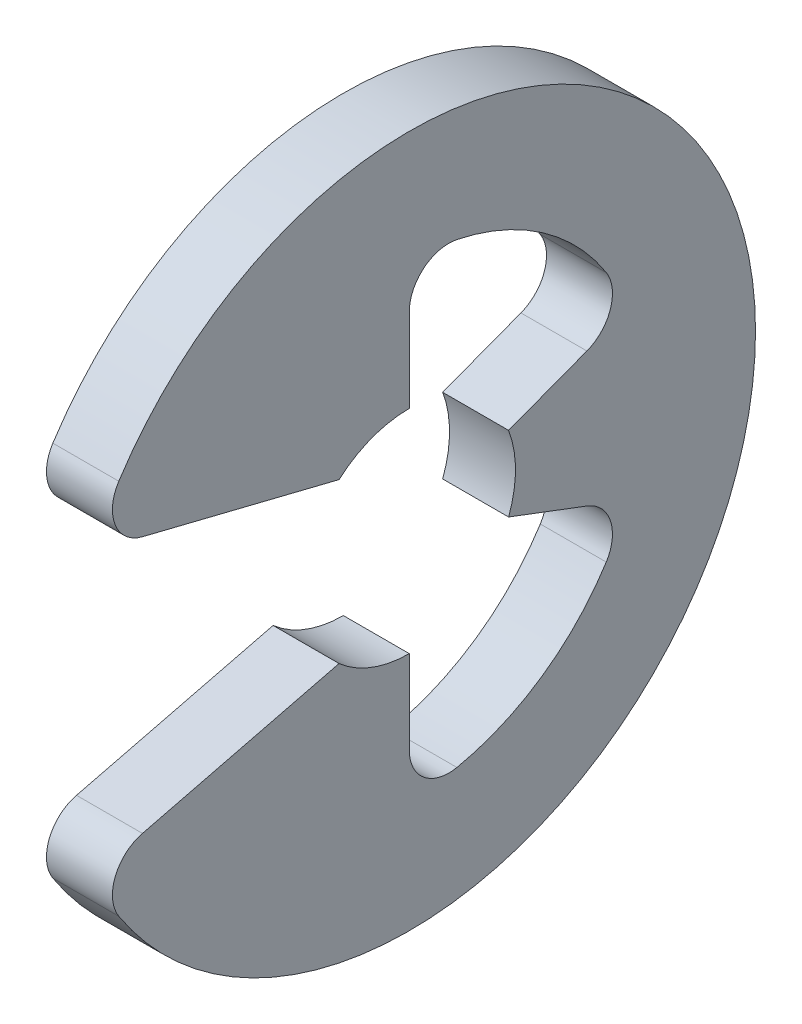
ISO-10303-21;
HEADER;
FILE_DESCRIPTION(('STEP AP214'),'2;1');
FILE_NAME('part.step','',(''),(''),'','','');
FILE_SCHEMA(('AUTOMOTIVE_DESIGN { 1 0 10303 214 1 1 1 1 }'));
ENDSEC;
DATA;
#1=APPLICATION_CONTEXT('core data for automotive mechanical design processes');
#2=APPLICATION_PROTOCOL_DEFINITION('international standard','automotive_design',2000,#1);
#3=PRODUCT_CONTEXT('',#1,'mechanical');
#4=PRODUCT('Part','Part','',(#3));
#5=PRODUCT_RELATED_PRODUCT_CATEGORY('part','',(#4));
#6=PRODUCT_DEFINITION_FORMATION('','',#4);
#7=PRODUCT_DEFINITION_CONTEXT('part definition',#1,'design');
#8=PRODUCT_DEFINITION('design','',#6,#7);
#9=PRODUCT_DEFINITION_SHAPE('','',#8);
#10=(LENGTH_UNIT() NAMED_UNIT(*) SI_UNIT(.MILLI.,.METRE.));
#11=(NAMED_UNIT(*) PLANE_ANGLE_UNIT() SI_UNIT($,.RADIAN.));
#12=(NAMED_UNIT(*) SI_UNIT($,.STERADIAN.) SOLID_ANGLE_UNIT());
#13=UNCERTAINTY_MEASURE_WITH_UNIT(LENGTH_MEASURE(1.E-05),#10,'distance_accuracy_value','');
#14=(GEOMETRIC_REPRESENTATION_CONTEXT(3) GLOBAL_UNCERTAINTY_ASSIGNED_CONTEXT((#13)) GLOBAL_UNIT_ASSIGNED_CONTEXT((#10,
#11,#12)) REPRESENTATION_CONTEXT('',''));
#15=CARTESIAN_POINT('',(0.,0.,0.));
#16=DIRECTION('',(0.,0.,1.));
#17=DIRECTION('',(1.,0.,0.));
#18=AXIS2_PLACEMENT_3D('',#15,#16,#17);
#19=CARTESIAN_POINT('',(0.25,1.26497562316669,1.950759255468));
#20=DIRECTION('',(-1.,0.,0.));
#21=DIRECTION('',(0.,0.,1.));
#22=AXIS2_PLACEMENT_3D('',#19,#20,#21);
#23=CYLINDRICAL_SURFACE('',#22,0.3);
#24=CARTESIAN_POINT('',(-0.25,1.26497562316669,1.950759255468));
#25=DIRECTION('',(-1.,0.,0.));
#26=DIRECTION('',(0.,0.,1.));
#27=AXIS2_PLACEMENT_3D('',#24,#25,#26);
#28=CIRCLE('',#27,0.3);
#29=CARTESIAN_POINT('',(-0.25,0.973814574189076,2.02304510165006));
#30=VERTEX_POINT('',#29);
#31=CARTESIAN_POINT('',(-0.25,1.42819828422045,2.20247012714128));
#32=VERTEX_POINT('',#31);
#33=EDGE_CURVE('E200',#30,#32,#28,.T.);
#34=ORIENTED_EDGE('',*,*,#33,.F.);
#35=DIRECTION('',(-1.,0.,0.));
#36=VECTOR('',#35,1.);
#37=CARTESIAN_POINT('',(0.25,0.973814574189076,2.02304510165006));
#38=LINE('',#37,#36);
#39=CARTESIAN_POINT('',(0.25,0.973814574189076,2.02304510165006));
#40=VERTEX_POINT('',#39);
#41=EDGE_CURVE('E11',#40,#30,#38,.T.);
#42=ORIENTED_EDGE('',*,*,#41,.F.);
#43=CARTESIAN_POINT('',(0.25,1.26497562316669,1.950759255468));
#44=DIRECTION('',(-1.,0.,0.));
#45=DIRECTION('',(0.,0.,1.));
#46=AXIS2_PLACEMENT_3D('',#43,#44,#45);
#47=CIRCLE('',#46,0.3);
#48=CARTESIAN_POINT('',(0.25,1.42819828422045,2.20247012714128));
#49=VERTEX_POINT('',#48);
#50=EDGE_CURVE('E250',#40,#49,#47,.T.);
#51=ORIENTED_EDGE('',*,*,#50,.T.);
#52=DIRECTION('',(-1.,0.,0.));
#53=VECTOR('',#52,1.);
#54=CARTESIAN_POINT('',(0.25,1.42819828422045,2.20247012714128));
#55=LINE('',#54,#53);
#56=EDGE_CURVE('E46',#49,#32,#55,.T.);
#57=ORIENTED_EDGE('',*,*,#56,.T.);
#58=EDGE_LOOP('',(#34,#42,#51,#57));
#59=FACE_BOUND('',#58,.T.);
#60=ADVANCED_FACE('F43',(#59),#23,.T.);
#61=CARTESIAN_POINT('',(0.25,0.603749999999992,0.532457451351758));
#62=DIRECTION('',(0.,-0.970536829925371,0.240952820606879));
#63=DIRECTION('',(0.,-0.240952820606879,-0.970536829925371));
#64=AXIS2_PLACEMENT_3D('',#61,#62,#63);
#65=PLANE('',#64);
#66=DIRECTION('',(0.,0.240952820606879,0.970536829925371));
#67=VECTOR('',#66,1.);
#68=CARTESIAN_POINT('',(-0.25,0.603749999999992,0.532457451351758));
#69=LINE('',#68,#67);
#70=CARTESIAN_POINT('',(-0.25,0.603749999999992,0.532457451351758));
#71=VERTEX_POINT('',#70);
#72=EDGE_CURVE('E248',#71,#30,#69,.T.);
#73=ORIENTED_EDGE('',*,*,#72,.F.);
#74=DIRECTION('',(-1.,0.,0.));
#75=VECTOR('',#74,1.);
#76=CARTESIAN_POINT('',(0.25,0.603749999999992,0.532457451351758));
#77=LINE('',#76,#75);
#78=CARTESIAN_POINT('',(0.25,0.603749999999992,0.532457451351758));
#79=VERTEX_POINT('',#78);
#80=EDGE_CURVE('E52',#79,#71,#77,.T.);
#81=ORIENTED_EDGE('',*,*,#80,.F.);
#82=DIRECTION('',(0.,0.240952820606879,0.970536829925371));
#83=VECTOR('',#82,1.);
#84=CARTESIAN_POINT('',(0.25,0.603749999999992,0.532457451351758));
#85=LINE('',#84,#83);
#86=EDGE_CURVE('E190',#79,#40,#85,.T.);
#87=ORIENTED_EDGE('',*,*,#86,.T.);
#88=ORIENTED_EDGE('',*,*,#41,.T.);
#89=EDGE_LOOP('',(#73,#81,#87,#88));
#90=FACE_BOUND('',#89,.T.);
#91=ADVANCED_FACE('F282',(#90),#65,.T.);
#92=CARTESIAN_POINT('',(0.25,0.,0.));
#93=DIRECTION('',(-1.,0.,0.));
#94=DIRECTION('',(0.,0.,1.));
#95=AXIS2_PLACEMENT_3D('',#92,#93,#94);
#96=CYLINDRICAL_SURFACE('',#95,0.805);
#97=CARTESIAN_POINT('',(-0.25,0.,0.));
#98=DIRECTION('',(1.,0.,0.));
#99=DIRECTION('',(0.,0.,-1.));
#100=AXIS2_PLACEMENT_3D('',#97,#98,#99);
#101=CIRCLE('',#100,0.805);
#102=CARTESIAN_POINT('',(-0.25,0.805,0.));
#103=VERTEX_POINT('',#102);
#104=EDGE_CURVE('E177',#103,#71,#101,.T.);
#105=ORIENTED_EDGE('',*,*,#104,.F.);
#106=DIRECTION('',(-1.,0.,0.));
#107=VECTOR('',#106,1.);
#108=CARTESIAN_POINT('',(0.25,0.805,0.));
#109=LINE('',#108,#107);
#110=CARTESIAN_POINT('',(0.25,0.805,0.));
#111=VERTEX_POINT('',#110);
#112=EDGE_CURVE('E172',#111,#103,#109,.T.);
#113=ORIENTED_EDGE('',*,*,#112,.F.);
#114=CARTESIAN_POINT('',(0.25,0.,0.));
#115=DIRECTION('',(1.,0.,0.));
#116=DIRECTION('',(0.,0.,-1.));
#117=AXIS2_PLACEMENT_3D('',#114,#115,#116);
#118=CIRCLE('',#117,0.805);
#119=EDGE_CURVE('E175',#111,#79,#118,.T.);
#120=ORIENTED_EDGE('',*,*,#119,.T.);
#121=ORIENTED_EDGE('',*,*,#80,.T.);
#122=EDGE_LOOP('',(#105,#113,#120,#121));
#123=FACE_BOUND('',#122,.T.);
#124=ADVANCED_FACE('F174',(#123),#96,.F.);
#125=CARTESIAN_POINT('',(0.25,1.43939170872805,0.));
#126=DIRECTION('',(0.,0.,-1.));
#127=DIRECTION('',(0.,1.,0.));
#128=AXIS2_PLACEMENT_3D('',#125,#126,#127);
#129=PLANE('',#128);
#130=DIRECTION('',(0.,-1.,0.));
#131=VECTOR('',#130,1.);
#132=CARTESIAN_POINT('',(-0.25,1.43939170872805,0.));
#133=LINE('',#132,#131);
#134=CARTESIAN_POINT('',(-0.25,1.43939170872805,0.));
#135=VERTEX_POINT('',#134);
#136=EDGE_CURVE('E245',#135,#103,#133,.T.);
#137=ORIENTED_EDGE('',*,*,#136,.F.);
#138=DIRECTION('',(-1.,0.,0.));
#139=VECTOR('',#138,1.);
#140=CARTESIAN_POINT('',(0.25,1.43939170872805,0.));
#141=LINE('',#140,#139);
#142=CARTESIAN_POINT('',(0.25,1.43939170872805,0.));
#143=VERTEX_POINT('',#142);
#144=EDGE_CURVE('E182',#143,#135,#141,.T.);
#145=ORIENTED_EDGE('',*,*,#144,.F.);
#146=DIRECTION('',(0.,-1.,0.));
#147=VECTOR('',#146,1.);
#148=CARTESIAN_POINT('',(0.25,1.43939170872805,0.));
#149=LINE('',#148,#147);
#150=EDGE_CURVE('E188',#143,#111,#149,.T.);
#151=ORIENTED_EDGE('',*,*,#150,.T.);
#152=ORIENTED_EDGE('',*,*,#112,.T.);
#153=EDGE_LOOP('',(#137,#145,#151,#152));
#154=FACE_BOUND('',#153,.T.);
#155=ADVANCED_FACE('F192',(#154),#129,.T.);
#156=CARTESIAN_POINT('',(0.25,1.43939170872805,-0.3));
#157=DIRECTION('',(-1.,0.,0.));
#158=DIRECTION('',(0.,0.,1.));
#159=AXIS2_PLACEMENT_3D('',#156,#157,#158);
#160=CYLINDRICAL_SURFACE('',#159,0.3);
#161=CARTESIAN_POINT('',(-0.25,1.43939170872805,-0.3));
#162=DIRECTION('',(1.,0.,0.));
#163=DIRECTION('',(0.,0.,-1.));
#164=AXIS2_PLACEMENT_3D('',#161,#162,#163);
#165=CIRCLE('',#164,0.3);
#166=CARTESIAN_POINT('',(-0.25,1.73308067079849,-0.361211057481351));
#167=VERTEX_POINT('',#166);
#168=EDGE_CURVE('E242',#167,#135,#165,.T.);
#169=ORIENTED_EDGE('',*,*,#168,.F.);
#170=DIRECTION('',(-1.,0.,0.));
#171=VECTOR('',#170,1.);
#172=CARTESIAN_POINT('',(0.25,1.73308067079849,-0.361211057481351));
#173=LINE('',#172,#171);
#174=CARTESIAN_POINT('',(0.25,1.73308067079849,-0.361211057481351));
#175=VERTEX_POINT('',#174);
#176=EDGE_CURVE('E254',#175,#167,#173,.T.);
#177=ORIENTED_EDGE('',*,*,#176,.F.);
#178=CARTESIAN_POINT('',(0.25,1.43939170872805,-0.3));
#179=DIRECTION('',(1.,0.,0.));
#180=DIRECTION('',(0.,0.,-1.));
#181=AXIS2_PLACEMENT_3D('',#178,#179,#180);
#182=CIRCLE('',#181,0.3);
#183=EDGE_CURVE('E193',#175,#143,#182,.T.);
#184=ORIENTED_EDGE('',*,*,#183,.T.);
#185=ORIENTED_EDGE('',*,*,#144,.T.);
#186=EDGE_LOOP('',(#169,#177,#184,#185));
#187=FACE_BOUND('',#186,.T.);
#188=ADVANCED_FACE('F295',(#187),#160,.F.);
#189=CARTESIAN_POINT('',(0.25,0.,0.));
#190=DIRECTION('',(-1.,0.,0.));
#191=DIRECTION('',(0.,0.,1.));
#192=AXIS2_PLACEMENT_3D('',#189,#190,#191);
#193=CYLINDRICAL_SURFACE('',#192,1.77032258064516);
#194=CARTESIAN_POINT('',(-0.25,0.,0.));
#195=DIRECTION('',(1.,0.,0.));
#196=DIRECTION('',(0.,0.,-1.));
#197=AXIS2_PLACEMENT_3D('',#194,#195,#196);
#198=CIRCLE('',#197,1.77032258064516);
#199=CARTESIAN_POINT('',(-0.25,0.950618552684853,-1.49344112934976));
#200=VERTEX_POINT('',#199);
#201=EDGE_CURVE('E239',#200,#167,#198,.T.);
#202=ORIENTED_EDGE('',*,*,#201,.F.);
#203=DIRECTION('',(-1.,0.,0.));
#204=VECTOR('',#203,1.);
#205=CARTESIAN_POINT('',(0.25,0.950618552684853,-1.49344112934976));
#206=LINE('',#205,#204);
#207=CARTESIAN_POINT('',(0.25,0.950618552684853,-1.49344112934976));
#208=VERTEX_POINT('',#207);
#209=EDGE_CURVE('E256',#208,#200,#206,.T.);
#210=ORIENTED_EDGE('',*,*,#209,.F.);
#211=CARTESIAN_POINT('',(0.25,0.,0.));
#212=DIRECTION('',(1.,0.,0.));
#213=DIRECTION('',(0.,0.,-1.));
#214=AXIS2_PLACEMENT_3D('',#211,#212,#213);
#215=CIRCLE('',#214,1.77032258064516);
#216=EDGE_CURVE('E195',#208,#175,#215,.T.);
#217=ORIENTED_EDGE('',*,*,#216,.T.);
#218=ORIENTED_EDGE('',*,*,#176,.T.);
#219=EDGE_LOOP('',(#202,#210,#217,#218));
#220=FACE_BOUND('',#219,.T.);
#221=ADVANCED_FACE('F298',(#220),#193,.F.);
#222=CARTESIAN_POINT('',(0.25,0.789526123020693,-1.24036163767788));
#223=DIRECTION('',(-1.,0.,0.));
#224=DIRECTION('',(0.,0.,1.));
#225=AXIS2_PLACEMENT_3D('',#222,#223,#224);
#226=CYLINDRICAL_SURFACE('',#225,0.3);
#227=CARTESIAN_POINT('',(-0.25,0.789526123020693,-1.24036163767788));
#228=DIRECTION('',(1.,0.,0.));
#229=DIRECTION('',(0.,0.,-1.));
#230=AXIS2_PLACEMENT_3D('',#227,#228,#229);
#231=CIRCLE('',#230,0.3);
#232=CARTESIAN_POINT('',(-0.25,0.508901819012647,-1.34642765485587));
#233=VERTEX_POINT('',#232);
#234=EDGE_CURVE('E236',#233,#200,#231,.T.);
#235=ORIENTED_EDGE('',*,*,#234,.F.);
#236=DIRECTION('',(-1.,0.,0.));
#237=VECTOR('',#236,1.);
#238=CARTESIAN_POINT('',(0.25,0.508901819012647,-1.34642765485587));
#239=LINE('',#238,#237);
#240=CARTESIAN_POINT('',(0.25,0.508901819012647,-1.34642765485587));
#241=VERTEX_POINT('',#240);
#242=EDGE_CURVE('E258',#241,#233,#239,.T.);
#243=ORIENTED_EDGE('',*,*,#242,.F.);
#244=CARTESIAN_POINT('',(0.25,0.789526123020693,-1.24036163767788));
#245=DIRECTION('',(1.,0.,0.));
#246=DIRECTION('',(0.,0.,-1.));
#247=AXIS2_PLACEMENT_3D('',#244,#245,#246);
#248=CIRCLE('',#247,0.3);
#249=EDGE_CURVE('E506',#241,#208,#248,.T.);
#250=ORIENTED_EDGE('',*,*,#249,.T.);
#251=ORIENTED_EDGE('',*,*,#209,.T.);
#252=EDGE_LOOP('',(#235,#243,#250,#251));
#253=FACE_BOUND('',#252,.T.);
#254=ADVANCED_FACE('F302',(#253),#226,.F.);
#255=CARTESIAN_POINT('',(0.25,0.284610479427585,-0.753008549088256));
#256=DIRECTION('',(0.,0.935414346693486,0.353553390593274));
#257=DIRECTION('',(0.,-0.353553390593274,0.935414346693486));
#258=AXIS2_PLACEMENT_3D('',#255,#256,#257);
#259=PLANE('',#258);
#260=DIRECTION('',(0.,0.353553390593274,-0.935414346693485));
#261=VECTOR('',#260,1.);
#262=CARTESIAN_POINT('',(-0.25,0.284610479427585,-0.753008549088256));
#263=LINE('',#262,#261);
#264=CARTESIAN_POINT('',(-0.25,0.284610479427585,-0.753008549088256));
#265=VERTEX_POINT('',#264);
#266=EDGE_CURVE('E233',#265,#233,#263,.T.);
#267=ORIENTED_EDGE('',*,*,#266,.F.);
#268=DIRECTION('',(-1.,0.,0.));
#269=VECTOR('',#268,1.);
#270=CARTESIAN_POINT('',(0.25,0.284610479427585,-0.753008549088256));
#271=LINE('',#270,#269);
#272=CARTESIAN_POINT('',(0.25,0.284610479427585,-0.753008549088256));
#273=VERTEX_POINT('',#272);
#274=EDGE_CURVE('E260',#273,#265,#271,.T.);
#275=ORIENTED_EDGE('',*,*,#274,.F.);
#276=DIRECTION('',(0.,0.353553390593274,-0.935414346693485));
#277=VECTOR('',#276,1.);
#278=CARTESIAN_POINT('',(0.25,0.284610479427585,-0.753008549088256));
#279=LINE('',#278,#277);
#280=EDGE_CURVE('E510',#273,#241,#279,.T.);
#281=ORIENTED_EDGE('',*,*,#280,.T.);
#282=ORIENTED_EDGE('',*,*,#242,.T.);
#283=EDGE_LOOP('',(#267,#275,#281,#282));
#284=FACE_BOUND('',#283,.T.);
#285=ADVANCED_FACE('F306',(#284),#259,.T.);
#286=CARTESIAN_POINT('',(0.25,0.,0.));
#287=DIRECTION('',(-1.,0.,0.));
#288=DIRECTION('',(0.,0.,1.));
#289=AXIS2_PLACEMENT_3D('',#286,#287,#288);
#290=CYLINDRICAL_SURFACE('',#289,0.805);
#291=CARTESIAN_POINT('',(-0.25,0.,0.));
#292=DIRECTION('',(1.,0.,0.));
#293=DIRECTION('',(0.,0.,-1.));
#294=AXIS2_PLACEMENT_3D('',#291,#292,#293);
#295=CIRCLE('',#294,0.805);
#296=CARTESIAN_POINT('',(-0.25,-0.284610479427585,-0.753008549088256));
#297=VERTEX_POINT('',#296);
#298=EDGE_CURVE('E230',#297,#265,#295,.T.);
#299=ORIENTED_EDGE('',*,*,#298,.F.);
#300=DIRECTION('',(-1.,0.,0.));
#301=VECTOR('',#300,1.);
#302=CARTESIAN_POINT('',(0.25,-0.284610479427585,-0.753008549088256));
#303=LINE('',#302,#301);
#304=CARTESIAN_POINT('',(0.25,-0.284610479427585,-0.753008549088256));
#305=VERTEX_POINT('',#304);
#306=EDGE_CURVE('E262',#305,#297,#303,.T.);
#307=ORIENTED_EDGE('',*,*,#306,.F.);
#308=CARTESIAN_POINT('',(0.25,0.,0.));
#309=DIRECTION('',(1.,0.,0.));
#310=DIRECTION('',(0.,0.,-1.));
#311=AXIS2_PLACEMENT_3D('',#308,#309,#310);
#312=CIRCLE('',#311,0.805);
#313=EDGE_CURVE('E499',#305,#273,#312,.T.);
#314=ORIENTED_EDGE('',*,*,#313,.T.);
#315=ORIENTED_EDGE('',*,*,#274,.T.);
#316=EDGE_LOOP('',(#299,#307,#314,#315));
#317=FACE_BOUND('',#316,.T.);
#318=ADVANCED_FACE('F310',(#317),#290,.F.);
#319=CARTESIAN_POINT('',(0.25,-0.508901819012647,-1.34642765485587));
#320=DIRECTION('',(0.,-0.935414346693485,0.353553390593274));
#321=DIRECTION('',(0.,-0.353553390593274,-0.935414346693485));
#322=AXIS2_PLACEMENT_3D('',#319,#320,#321);
#323=PLANE('',#322);
#324=DIRECTION('',(0.,0.353553390593274,0.935414346693485));
#325=VECTOR('',#324,1.);
#326=CARTESIAN_POINT('',(-0.25,-0.508901819012647,-1.34642765485587));
#327=LINE('',#326,#325);
#328=CARTESIAN_POINT('',(-0.25,-0.508901819012647,-1.34642765485587));
#329=VERTEX_POINT('',#328);
#330=EDGE_CURVE('E227',#329,#297,#327,.T.);
#331=ORIENTED_EDGE('',*,*,#330,.F.);
#332=DIRECTION('',(-1.,0.,0.));
#333=VECTOR('',#332,1.);
#334=CARTESIAN_POINT('',(0.25,-0.508901819012647,-1.34642765485587));
#335=LINE('',#334,#333);
#336=CARTESIAN_POINT('',(0.25,-0.508901819012647,-1.34642765485587));
#337=VERTEX_POINT('',#336);
#338=EDGE_CURVE('E264',#337,#329,#335,.T.);
#339=ORIENTED_EDGE('',*,*,#338,.F.);
#340=DIRECTION('',(0.,0.353553390593274,0.935414346693485));
#341=VECTOR('',#340,1.);
#342=CARTESIAN_POINT('',(0.25,-0.508901819012647,-1.34642765485587));
#343=LINE('',#342,#341);
#344=EDGE_CURVE('E495',#337,#305,#343,.T.);
#345=ORIENTED_EDGE('',*,*,#344,.T.);
#346=ORIENTED_EDGE('',*,*,#306,.T.);
#347=EDGE_LOOP('',(#331,#339,#345,#346));
#348=FACE_BOUND('',#347,.T.);
#349=ADVANCED_FACE('F314',(#348),#323,.T.);
#350=CARTESIAN_POINT('',(0.25,-0.789526123020693,-1.24036163767788));
#351=DIRECTION('',(-1.,0.,0.));
#352=DIRECTION('',(0.,0.,1.));
#353=AXIS2_PLACEMENT_3D('',#350,#351,#352);
#354=CYLINDRICAL_SURFACE('',#353,0.3);
#355=CARTESIAN_POINT('',(-0.25,-0.789526123020693,-1.24036163767788));
#356=DIRECTION('',(1.,0.,0.));
#357=DIRECTION('',(0.,0.,-1.));
#358=AXIS2_PLACEMENT_3D('',#355,#356,#357);
#359=CIRCLE('',#358,0.3);
#360=CARTESIAN_POINT('',(-0.25,-0.950618552684853,-1.49344112934976));
#361=VERTEX_POINT('',#360);
#362=EDGE_CURVE('E224',#361,#329,#359,.T.);
#363=ORIENTED_EDGE('',*,*,#362,.F.);
#364=DIRECTION('',(-1.,0.,0.));
#365=VECTOR('',#364,1.);
#366=CARTESIAN_POINT('',(0.25,-0.950618552684853,-1.49344112934976));
#367=LINE('',#366,#365);
#368=CARTESIAN_POINT('',(0.25,-0.950618552684853,-1.49344112934976));
#369=VERTEX_POINT('',#368);
#370=EDGE_CURVE('E266',#369,#361,#367,.T.);
#371=ORIENTED_EDGE('',*,*,#370,.F.);
#372=CARTESIAN_POINT('',(0.25,-0.789526123020693,-1.24036163767788));
#373=DIRECTION('',(1.,0.,0.));
#374=DIRECTION('',(0.,0.,-1.));
#375=AXIS2_PLACEMENT_3D('',#372,#373,#374);
#376=CIRCLE('',#375,0.3);
#377=EDGE_CURVE('E516',#369,#337,#376,.T.);
#378=ORIENTED_EDGE('',*,*,#377,.T.);
#379=ORIENTED_EDGE('',*,*,#338,.T.);
#380=EDGE_LOOP('',(#363,#371,#378,#379));
#381=FACE_BOUND('',#380,.T.);
#382=ADVANCED_FACE('F318',(#381),#354,.F.);
#383=CARTESIAN_POINT('',(0.25,0.,0.));
#384=DIRECTION('',(-1.,0.,0.));
#385=DIRECTION('',(0.,0.,1.));
#386=AXIS2_PLACEMENT_3D('',#383,#384,#385);
#387=CYLINDRICAL_SURFACE('',#386,1.77032258064516);
#388=CARTESIAN_POINT('',(-0.25,0.,0.));
#389=DIRECTION('',(1.,0.,0.));
#390=DIRECTION('',(0.,0.,-1.));
#391=AXIS2_PLACEMENT_3D('',#388,#389,#390);
#392=CIRCLE('',#391,1.77032258064516);
#393=CARTESIAN_POINT('',(-0.25,-1.73308067079849,-0.361211057481351));
#394=VERTEX_POINT('',#393);
#395=EDGE_CURVE('E221',#394,#361,#392,.T.);
#396=ORIENTED_EDGE('',*,*,#395,.F.);
#397=DIRECTION('',(-1.,0.,0.));
#398=VECTOR('',#397,1.);
#399=CARTESIAN_POINT('',(0.25,-1.73308067079849,-0.361211057481351));
#400=LINE('',#399,#398);
#401=CARTESIAN_POINT('',(0.25,-1.73308067079849,-0.361211057481351));
#402=VERTEX_POINT('',#401);
#403=EDGE_CURVE('E268',#402,#394,#400,.T.);
#404=ORIENTED_EDGE('',*,*,#403,.F.);
#405=CARTESIAN_POINT('',(0.25,0.,0.));
#406=DIRECTION('',(1.,0.,0.));
#407=DIRECTION('',(0.,0.,-1.));
#408=AXIS2_PLACEMENT_3D('',#405,#406,#407);
#409=CIRCLE('',#408,1.77032258064516);
#410=EDGE_CURVE('E488',#402,#369,#409,.T.);
#411=ORIENTED_EDGE('',*,*,#410,.T.);
#412=ORIENTED_EDGE('',*,*,#370,.T.);
#413=EDGE_LOOP('',(#396,#404,#411,#412));
#414=FACE_BOUND('',#413,.T.);
#415=ADVANCED_FACE('F322',(#414),#387,.F.);
#416=CARTESIAN_POINT('',(0.25,-1.43939170872805,-0.3));
#417=DIRECTION('',(-1.,0.,0.));
#418=DIRECTION('',(0.,0.,1.));
#419=AXIS2_PLACEMENT_3D('',#416,#417,#418);
#420=CYLINDRICAL_SURFACE('',#419,0.3);
#421=CARTESIAN_POINT('',(-0.25,-1.43939170872805,-0.3));
#422=DIRECTION('',(1.,0.,0.));
#423=DIRECTION('',(0.,0.,-1.));
#424=AXIS2_PLACEMENT_3D('',#421,#422,#423);
#425=CIRCLE('',#424,0.3);
#426=CARTESIAN_POINT('',(-0.25,-1.43939170872805,0.));
#427=VERTEX_POINT('',#426);
#428=EDGE_CURVE('E218',#427,#394,#425,.T.);
#429=ORIENTED_EDGE('',*,*,#428,.F.);
#430=DIRECTION('',(-1.,0.,0.));
#431=VECTOR('',#430,1.);
#432=CARTESIAN_POINT('',(0.25,-1.43939170872805,0.));
#433=LINE('',#432,#431);
#434=CARTESIAN_POINT('',(0.25,-1.43939170872805,0.));
#435=VERTEX_POINT('',#434);
#436=EDGE_CURVE('E270',#435,#427,#433,.T.);
#437=ORIENTED_EDGE('',*,*,#436,.F.);
#438=CARTESIAN_POINT('',(0.25,-1.43939170872805,-0.3));
#439=DIRECTION('',(1.,0.,0.));
#440=DIRECTION('',(0.,0.,-1.));
#441=AXIS2_PLACEMENT_3D('',#438,#439,#440);
#442=CIRCLE('',#441,0.3);
#443=EDGE_CURVE('E484',#435,#402,#442,.T.);
#444=ORIENTED_EDGE('',*,*,#443,.T.);
#445=ORIENTED_EDGE('',*,*,#403,.T.);
#446=EDGE_LOOP('',(#429,#437,#444,#445));
#447=FACE_BOUND('',#446,.T.);
#448=ADVANCED_FACE('F326',(#447),#420,.F.);
#449=CARTESIAN_POINT('',(0.25,-0.805,0.));
#450=DIRECTION('',(0.,0.,-1.));
#451=DIRECTION('',(0.,1.,0.));
#452=AXIS2_PLACEMENT_3D('',#449,#450,#451);
#453=PLANE('',#452);
#454=DIRECTION('',(0.,-1.,0.));
#455=VECTOR('',#454,1.);
#456=CARTESIAN_POINT('',(-0.25,-0.805,0.));
#457=LINE('',#456,#455);
#458=CARTESIAN_POINT('',(-0.25,-0.805,0.));
#459=VERTEX_POINT('',#458);
#460=EDGE_CURVE('E215',#459,#427,#457,.T.);
#461=ORIENTED_EDGE('',*,*,#460,.F.);
#462=DIRECTION('',(-1.,0.,0.));
#463=VECTOR('',#462,1.);
#464=CARTESIAN_POINT('',(0.25,-0.805,0.));
#465=LINE('',#464,#463);
#466=CARTESIAN_POINT('',(0.25,-0.805,0.));
#467=VERTEX_POINT('',#466);
#468=EDGE_CURVE('E272',#467,#459,#465,.T.);
#469=ORIENTED_EDGE('',*,*,#468,.F.);
#470=DIRECTION('',(0.,-1.,0.));
#471=VECTOR('',#470,1.);
#472=CARTESIAN_POINT('',(0.25,-0.805,0.));
#473=LINE('',#472,#471);
#474=EDGE_CURVE('E520',#467,#435,#473,.T.);
#475=ORIENTED_EDGE('',*,*,#474,.T.);
#476=ORIENTED_EDGE('',*,*,#436,.T.);
#477=EDGE_LOOP('',(#461,#469,#475,#476));
#478=FACE_BOUND('',#477,.T.);
#479=ADVANCED_FACE('F330',(#478),#453,.T.);
#480=CARTESIAN_POINT('',(0.25,0.,0.));
#481=DIRECTION('',(-1.,0.,0.));
#482=DIRECTION('',(0.,0.,1.));
#483=AXIS2_PLACEMENT_3D('',#480,#481,#482);
#484=CYLINDRICAL_SURFACE('',#483,0.805);
#485=CARTESIAN_POINT('',(-0.25,0.,0.));
#486=DIRECTION('',(1.,0.,0.));
#487=DIRECTION('',(0.,0.,-1.));
#488=AXIS2_PLACEMENT_3D('',#485,#486,#487);
#489=CIRCLE('',#488,0.805);
#490=CARTESIAN_POINT('',(-0.25,-0.603749999999992,0.532457451351758));
#491=VERTEX_POINT('',#490);
#492=EDGE_CURVE('E212',#491,#459,#489,.T.);
#493=ORIENTED_EDGE('',*,*,#492,.F.);
#494=DIRECTION('',(-1.,0.,0.));
#495=VECTOR('',#494,1.);
#496=CARTESIAN_POINT('',(0.25,-0.603749999999992,0.532457451351758));
#497=LINE('',#496,#495);
#498=CARTESIAN_POINT('',(0.25,-0.603749999999992,0.532457451351758));
#499=VERTEX_POINT('',#498);
#500=EDGE_CURVE('E274',#499,#491,#497,.T.);
#501=ORIENTED_EDGE('',*,*,#500,.F.);
#502=CARTESIAN_POINT('',(0.25,0.,0.));
#503=DIRECTION('',(1.,0.,0.));
#504=DIRECTION('',(0.,0.,-1.));
#505=AXIS2_PLACEMENT_3D('',#502,#503,#504);
#506=CIRCLE('',#505,0.805);
#507=EDGE_CURVE('E477',#499,#467,#506,.T.);
#508=ORIENTED_EDGE('',*,*,#507,.T.);
#509=ORIENTED_EDGE('',*,*,#468,.T.);
#510=EDGE_LOOP('',(#493,#501,#508,#509));
#511=FACE_BOUND('',#510,.T.);
#512=ADVANCED_FACE('F334',(#511),#484,.F.);
#513=CARTESIAN_POINT('',(0.25,-0.973814574189076,2.02304510165006));
#514=DIRECTION('',(0.,0.970536829925371,0.240952820606879));
#515=DIRECTION('',(0.,-0.240952820606879,0.970536829925371));
#516=AXIS2_PLACEMENT_3D('',#513,#514,#515);
#517=PLANE('',#516);
#518=DIRECTION('',(0.,0.240952820606879,-0.970536829925371));
#519=VECTOR('',#518,1.);
#520=CARTESIAN_POINT('',(-0.25,-0.973814574189076,2.02304510165006));
#521=LINE('',#520,#519);
#522=CARTESIAN_POINT('',(-0.25,-0.973814574189076,2.02304510165006));
#523=VERTEX_POINT('',#522);
#524=EDGE_CURVE('E209',#523,#491,#521,.T.);
#525=ORIENTED_EDGE('',*,*,#524,.F.);
#526=DIRECTION('',(-1.,0.,0.));
#527=VECTOR('',#526,1.);
#528=CARTESIAN_POINT('',(0.25,-0.973814574189076,2.02304510165006));
#529=LINE('',#528,#527);
#530=CARTESIAN_POINT('',(0.25,-0.973814574189076,2.02304510165006));
#531=VERTEX_POINT('',#530);
#532=EDGE_CURVE('E276',#531,#523,#529,.T.);
#533=ORIENTED_EDGE('',*,*,#532,.F.);
#534=DIRECTION('',(0.,0.240952820606879,-0.970536829925371));
#535=VECTOR('',#534,1.);
#536=CARTESIAN_POINT('',(0.25,-0.973814574189076,2.02304510165006));
#537=LINE('',#536,#535);
#538=EDGE_CURVE('E473',#531,#499,#537,.T.);
#539=ORIENTED_EDGE('',*,*,#538,.T.);
#540=ORIENTED_EDGE('',*,*,#500,.T.);
#541=EDGE_LOOP('',(#525,#533,#539,#540));
#542=FACE_BOUND('',#541,.T.);
#543=ADVANCED_FACE('F338',(#542),#517,.T.);
#544=CARTESIAN_POINT('',(0.25,-1.26497562316669,1.950759255468));
#545=DIRECTION('',(-1.,0.,0.));
#546=DIRECTION('',(0.,0.,1.));
#547=AXIS2_PLACEMENT_3D('',#544,#545,#546);
#548=CYLINDRICAL_SURFACE('',#547,0.3);
#549=CARTESIAN_POINT('',(-0.25,-1.26497562316669,1.950759255468));
#550=DIRECTION('',(-1.,0.,0.));
#551=DIRECTION('',(0.,0.,1.));
#552=AXIS2_PLACEMENT_3D('',#549,#550,#551);
#553=CIRCLE('',#552,0.3);
#554=CARTESIAN_POINT('',(-0.25,-1.42819828422046,2.20247012714128));
#555=VERTEX_POINT('',#554);
#556=EDGE_CURVE('E206',#555,#523,#553,.T.);
#557=ORIENTED_EDGE('',*,*,#556,.F.);
#558=DIRECTION('',(-1.,0.,0.));
#559=VECTOR('',#558,1.);
#560=CARTESIAN_POINT('',(0.25,-1.42819828422046,2.20247012714128));
#561=LINE('',#560,#559);
#562=CARTESIAN_POINT('',(0.25,-1.42819828422046,2.20247012714128));
#563=VERTEX_POINT('',#562);
#564=EDGE_CURVE('E277',#563,#555,#561,.T.);
#565=ORIENTED_EDGE('',*,*,#564,.F.);
#566=CARTESIAN_POINT('',(0.25,-1.26497562316669,1.950759255468));
#567=DIRECTION('',(-1.,0.,0.));
#568=DIRECTION('',(0.,0.,1.));
#569=AXIS2_PLACEMENT_3D('',#566,#567,#568);
#570=CIRCLE('',#569,0.3);
#571=EDGE_CURVE('E524',#563,#531,#570,.T.);
#572=ORIENTED_EDGE('',*,*,#571,.T.);
#573=ORIENTED_EDGE('',*,*,#532,.T.);
#574=EDGE_LOOP('',(#557,#565,#572,#573));
#575=FACE_BOUND('',#574,.T.);
#576=ADVANCED_FACE('F342',(#575),#548,.T.);
#577=CARTESIAN_POINT('',(0.25,0.,0.));
#578=DIRECTION('',(-1.,0.,0.));
#579=DIRECTION('',(0.,0.,1.));
#580=AXIS2_PLACEMENT_3D('',#577,#578,#579);
#581=CYLINDRICAL_SURFACE('',#580,2.625);
#582=CARTESIAN_POINT('',(-0.25,0.,0.));
#583=DIRECTION('',(-1.,0.,0.));
#584=DIRECTION('',(0.,0.,1.));
#585=AXIS2_PLACEMENT_3D('',#582,#583,#584);
#586=CIRCLE('',#585,2.625);
#587=EDGE_CURVE('E203',#32,#555,#586,.T.);
#588=ORIENTED_EDGE('',*,*,#587,.F.);
#589=ORIENTED_EDGE('',*,*,#56,.F.);
#590=CARTESIAN_POINT('',(0.25,0.,0.));
#591=DIRECTION('',(-1.,0.,0.));
#592=DIRECTION('',(0.,0.,1.));
#593=AXIS2_PLACEMENT_3D('',#590,#591,#592);
#594=CIRCLE('',#593,2.625);
#595=EDGE_CURVE('E526',#49,#563,#594,.T.);
#596=ORIENTED_EDGE('',*,*,#595,.T.);
#597=ORIENTED_EDGE('',*,*,#564,.T.);
#598=EDGE_LOOP('',(#588,#589,#596,#597));
#599=FACE_BOUND('',#598,.T.);
#600=ADVANCED_FACE('F279',(#599),#581,.T.);
#601=CARTESIAN_POINT('',(0.25,1.26497562316669,1.950759255468));
#602=DIRECTION('',(-1.,0.,0.));
#603=DIRECTION('',(0.,0.,1.));
#604=AXIS2_PLACEMENT_3D('',#601,#602,#603);
#605=PLANE('',#604);
#606=ORIENTED_EDGE('',*,*,#50,.F.);
#607=ORIENTED_EDGE('',*,*,#86,.F.);
#608=ORIENTED_EDGE('',*,*,#119,.F.);
#609=ORIENTED_EDGE('',*,*,#150,.F.);
#610=ORIENTED_EDGE('',*,*,#183,.F.);
#611=ORIENTED_EDGE('',*,*,#216,.F.);
#612=ORIENTED_EDGE('',*,*,#249,.F.);
#613=ORIENTED_EDGE('',*,*,#280,.F.);
#614=ORIENTED_EDGE('',*,*,#313,.F.);
#615=ORIENTED_EDGE('',*,*,#344,.F.);
#616=ORIENTED_EDGE('',*,*,#377,.F.);
#617=ORIENTED_EDGE('',*,*,#410,.F.);
#618=ORIENTED_EDGE('',*,*,#443,.F.);
#619=ORIENTED_EDGE('',*,*,#474,.F.);
#620=ORIENTED_EDGE('',*,*,#507,.F.);
#621=ORIENTED_EDGE('',*,*,#538,.F.);
#622=ORIENTED_EDGE('',*,*,#571,.F.);
#623=ORIENTED_EDGE('',*,*,#595,.F.);
#624=EDGE_LOOP('',(#606,#607,#608,#609,#610,#611,#612,#613,#614,#615,#616,#617,#618,#619,#620,
#621,#622,#623));
#625=FACE_BOUND('',#624,.T.);
#626=ADVANCED_FACE('F186',(#625),#605,.F.);
#627=CARTESIAN_POINT('',(-0.25,1.26497562316669,1.950759255468));
#628=DIRECTION('',(-1.,0.,0.));
#629=DIRECTION('',(0.,0.,1.));
#630=AXIS2_PLACEMENT_3D('',#627,#628,#629);
#631=PLANE('',#630);
#632=ORIENTED_EDGE('',*,*,#33,.T.);
#633=ORIENTED_EDGE('',*,*,#587,.T.);
#634=ORIENTED_EDGE('',*,*,#556,.T.);
#635=ORIENTED_EDGE('',*,*,#524,.T.);
#636=ORIENTED_EDGE('',*,*,#492,.T.);
#637=ORIENTED_EDGE('',*,*,#460,.T.);
#638=ORIENTED_EDGE('',*,*,#428,.T.);
#639=ORIENTED_EDGE('',*,*,#395,.T.);
#640=ORIENTED_EDGE('',*,*,#362,.T.);
#641=ORIENTED_EDGE('',*,*,#330,.T.);
#642=ORIENTED_EDGE('',*,*,#298,.T.);
#643=ORIENTED_EDGE('',*,*,#266,.T.);
#644=ORIENTED_EDGE('',*,*,#234,.T.);
#645=ORIENTED_EDGE('',*,*,#201,.T.);
#646=ORIENTED_EDGE('',*,*,#168,.T.);
#647=ORIENTED_EDGE('',*,*,#136,.T.);
#648=ORIENTED_EDGE('',*,*,#104,.T.);
#649=ORIENTED_EDGE('',*,*,#72,.T.);
#650=EDGE_LOOP('',(#632,#633,#634,#635,#636,#637,#638,#639,#640,#641,#642,#643,#644,#645,#646,
#647,#648,#649));
#651=FACE_BOUND('',#650,.T.);
#652=ADVANCED_FACE('F281',(#651),#631,.T.);
#653=CLOSED_SHELL('',(#60,#91,#124,#155,#188,#221,#254,#285,#318,#349,#382,#415,#448,#479,#512,
#543,#576,#600,#626,#652));
#654=MANIFOLD_SOLID_BREP('B2',#653);
#655=ADVANCED_BREP_SHAPE_REPRESENTATION('',(#18,#654),#14);
#656=SHAPE_DEFINITION_REPRESENTATION(#9,#655);
ENDSEC;
END-ISO-10303-21;
